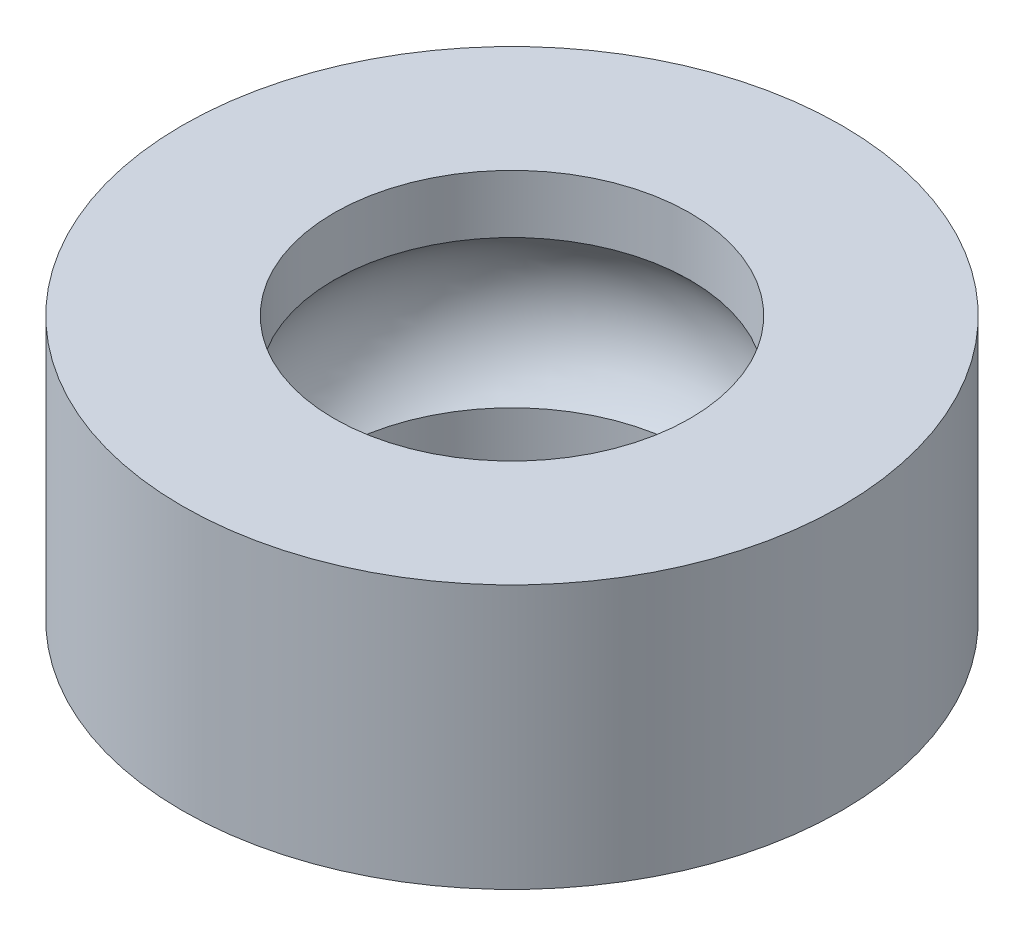
ISO-10303-21;
HEADER;
FILE_DESCRIPTION(('STEP AP214'),'2;1');
FILE_NAME('part.step','',(''),(''),'','','');
FILE_SCHEMA(('AUTOMOTIVE_DESIGN { 1 0 10303 214 1 1 1 1 }'));
ENDSEC;
DATA;
#1=APPLICATION_CONTEXT('core data for automotive mechanical design processes');
#2=APPLICATION_PROTOCOL_DEFINITION('international standard','automotive_design',2000,#1);
#3=PRODUCT_CONTEXT('',#1,'mechanical');
#4=PRODUCT('Part','Part','',(#3));
#5=PRODUCT_RELATED_PRODUCT_CATEGORY('part','',(#4));
#6=PRODUCT_DEFINITION_FORMATION('','',#4);
#7=PRODUCT_DEFINITION_CONTEXT('part definition',#1,'design');
#8=PRODUCT_DEFINITION('design','',#6,#7);
#9=PRODUCT_DEFINITION_SHAPE('','',#8);
#10=(LENGTH_UNIT() NAMED_UNIT(*) SI_UNIT(.MILLI.,.METRE.));
#11=(NAMED_UNIT(*) PLANE_ANGLE_UNIT() SI_UNIT($,.RADIAN.));
#12=(NAMED_UNIT(*) SI_UNIT($,.STERADIAN.) SOLID_ANGLE_UNIT());
#13=UNCERTAINTY_MEASURE_WITH_UNIT(LENGTH_MEASURE(1.E-05),#10,'distance_accuracy_value','');
#14=(GEOMETRIC_REPRESENTATION_CONTEXT(3) GLOBAL_UNCERTAINTY_ASSIGNED_CONTEXT((#13)) GLOBAL_UNIT_ASSIGNED_CONTEXT((#10,
#11,#12)) REPRESENTATION_CONTEXT('',''));
#15=CARTESIAN_POINT('',(0.,0.,0.));
#16=DIRECTION('',(0.,0.,1.));
#17=DIRECTION('',(1.,0.,0.));
#18=AXIS2_PLACEMENT_3D('',#15,#16,#17);
#19=CARTESIAN_POINT('',(5.,4.,0.));
#20=DIRECTION('',(0.,1.,0.));
#21=DIRECTION('',(0.,0.,1.));
#22=AXIS2_PLACEMENT_3D('',#19,#20,#21);
#23=PLANE('',#22);
#24=CARTESIAN_POINT('',(0.,4.,0.));
#25=DIRECTION('',(0.,-1.,0.));
#26=DIRECTION('',(0.,0.,-1.));
#27=AXIS2_PLACEMENT_3D('',#24,#25,#26);
#28=CIRCLE('',#27,2.7);
#29=CARTESIAN_POINT('',(0.,4.,-2.7));
#30=VERTEX_POINT('',#29);
#31=EDGE_CURVE('E10',#30,#30,#28,.T.);
#32=ORIENTED_EDGE('',*,*,#31,.T.);
#33=EDGE_LOOP('',(#32));
#34=FACE_BOUND('',#33,.T.);
#35=CARTESIAN_POINT('',(0.,4.,0.));
#36=DIRECTION('',(0.,-1.,0.));
#37=DIRECTION('',(0.,0.,-1.));
#38=AXIS2_PLACEMENT_3D('',#35,#36,#37);
#39=CIRCLE('',#38,5.);
#40=CARTESIAN_POINT('',(0.,4.,-5.));
#41=VERTEX_POINT('',#40);
#42=EDGE_CURVE('E53',#41,#41,#39,.T.);
#43=ORIENTED_EDGE('',*,*,#42,.F.);
#44=EDGE_LOOP('',(#43));
#45=FACE_BOUND('',#44,.T.);
#46=ADVANCED_FACE('F31',(#34,#45),#23,.T.);
#47=CARTESIAN_POINT('',(0.,0.,0.));
#48=DIRECTION('',(0.,-1.,0.));
#49=DIRECTION('',(0.,0.,-1.));
#50=AXIS2_PLACEMENT_3D('',#47,#48,#49);
#51=CYLINDRICAL_SURFACE('',#50,2.7);
#52=CARTESIAN_POINT('',(0.,3.11803398874989,0.));
#53=DIRECTION('',(0.,-1.,0.));
#54=DIRECTION('',(0.,0.,-1.));
#55=AXIS2_PLACEMENT_3D('',#52,#53,#54);
#56=CIRCLE('',#55,2.7);
#57=CARTESIAN_POINT('',(0.,3.11803398874989,-2.7));
#58=VERTEX_POINT('',#57);
#59=EDGE_CURVE('E37',#58,#58,#56,.T.);
#60=ORIENTED_EDGE('',*,*,#59,.T.);
#61=EDGE_LOOP('',(#60));
#62=FACE_BOUND('',#61,.T.);
#63=ORIENTED_EDGE('',*,*,#31,.F.);
#64=EDGE_LOOP('',(#63));
#65=FACE_BOUND('',#64,.T.);
#66=ADVANCED_FACE('F61',(#62,#65),#51,.F.);
#67=CARTESIAN_POINT('',(0.,2.,0.));
#68=DIRECTION('',(0.,-1.,0.));
#69=DIRECTION('',(0.,0.,-1.));
#70=AXIS2_PLACEMENT_3D('',#67,#68,#69);
#71=TOROIDAL_SURFACE('',#70,1.7,1.5);
#72=CARTESIAN_POINT('',(0.,0.881966011250104,0.));
#73=DIRECTION('',(0.,-1.,0.));
#74=DIRECTION('',(0.,0.,-1.));
#75=AXIS2_PLACEMENT_3D('',#72,#73,#74);
#76=CIRCLE('',#75,2.7);
#77=CARTESIAN_POINT('',(0.,0.881966011250104,-2.7));
#78=VERTEX_POINT('',#77);
#79=EDGE_CURVE('E41',#78,#78,#76,.T.);
#80=ORIENTED_EDGE('',*,*,#79,.T.);
#81=EDGE_LOOP('',(#80));
#82=FACE_BOUND('',#81,.T.);
#83=ORIENTED_EDGE('',*,*,#59,.F.);
#84=EDGE_LOOP('',(#83));
#85=FACE_BOUND('',#84,.T.);
#86=ADVANCED_FACE('F65',(#82,#85),#71,.F.);
#87=CARTESIAN_POINT('',(0.,0.,0.));
#88=DIRECTION('',(0.,-1.,0.));
#89=DIRECTION('',(0.,0.,-1.));
#90=AXIS2_PLACEMENT_3D('',#87,#88,#89);
#91=CYLINDRICAL_SURFACE('',#90,2.7);
#92=CARTESIAN_POINT('',(0.,0.,0.));
#93=DIRECTION('',(0.,-1.,0.));
#94=DIRECTION('',(0.,0.,-1.));
#95=AXIS2_PLACEMENT_3D('',#92,#93,#94);
#96=CIRCLE('',#95,2.7);
#97=CARTESIAN_POINT('',(0.,0.,-2.7));
#98=VERTEX_POINT('',#97);
#99=EDGE_CURVE('E45',#98,#98,#96,.T.);
#100=ORIENTED_EDGE('',*,*,#99,.T.);
#101=EDGE_LOOP('',(#100));
#102=FACE_BOUND('',#101,.T.);
#103=ORIENTED_EDGE('',*,*,#79,.F.);
#104=EDGE_LOOP('',(#103));
#105=FACE_BOUND('',#104,.T.);
#106=ADVANCED_FACE('F69',(#102,#105),#91,.F.);
#107=CARTESIAN_POINT('',(2.7,0.,0.));
#108=DIRECTION('',(0.,-1.,0.));
#109=DIRECTION('',(0.,0.,-1.));
#110=AXIS2_PLACEMENT_3D('',#107,#108,#109);
#111=PLANE('',#110);
#112=CARTESIAN_POINT('',(0.,0.,0.));
#113=DIRECTION('',(0.,-1.,0.));
#114=DIRECTION('',(0.,0.,-1.));
#115=AXIS2_PLACEMENT_3D('',#112,#113,#114);
#116=CIRCLE('',#115,5.);
#117=CARTESIAN_POINT('',(0.,0.,-5.));
#118=VERTEX_POINT('',#117);
#119=EDGE_CURVE('E50',#118,#118,#116,.T.);
#120=ORIENTED_EDGE('',*,*,#119,.T.);
#121=EDGE_LOOP('',(#120));
#122=FACE_BOUND('',#121,.T.);
#123=ORIENTED_EDGE('',*,*,#99,.F.);
#124=EDGE_LOOP('',(#123));
#125=FACE_BOUND('',#124,.T.);
#126=ADVANCED_FACE('F76',(#122,#125),#111,.T.);
#127=CARTESIAN_POINT('',(0.,0.,0.));
#128=DIRECTION('',(0.,-1.,0.));
#129=DIRECTION('',(0.,0.,-1.));
#130=AXIS2_PLACEMENT_3D('',#127,#128,#129);
#131=CYLINDRICAL_SURFACE('',#130,5.);
#132=ORIENTED_EDGE('',*,*,#42,.T.);
#133=EDGE_LOOP('',(#132));
#134=FACE_BOUND('',#133,.T.);
#135=ORIENTED_EDGE('',*,*,#119,.F.);
#136=EDGE_LOOP('',(#135));
#137=FACE_BOUND('',#136,.T.);
#138=ADVANCED_FACE('F57',(#134,#137),#131,.T.);
#139=CLOSED_SHELL('',(#46,#66,#86,#106,#126,#138));
#140=MANIFOLD_SOLID_BREP('B2',#139);
#141=ADVANCED_BREP_SHAPE_REPRESENTATION('',(#18,#140),#14);
#142=SHAPE_DEFINITION_REPRESENTATION(#9,#141);
ENDSEC;
END-ISO-10303-21;
